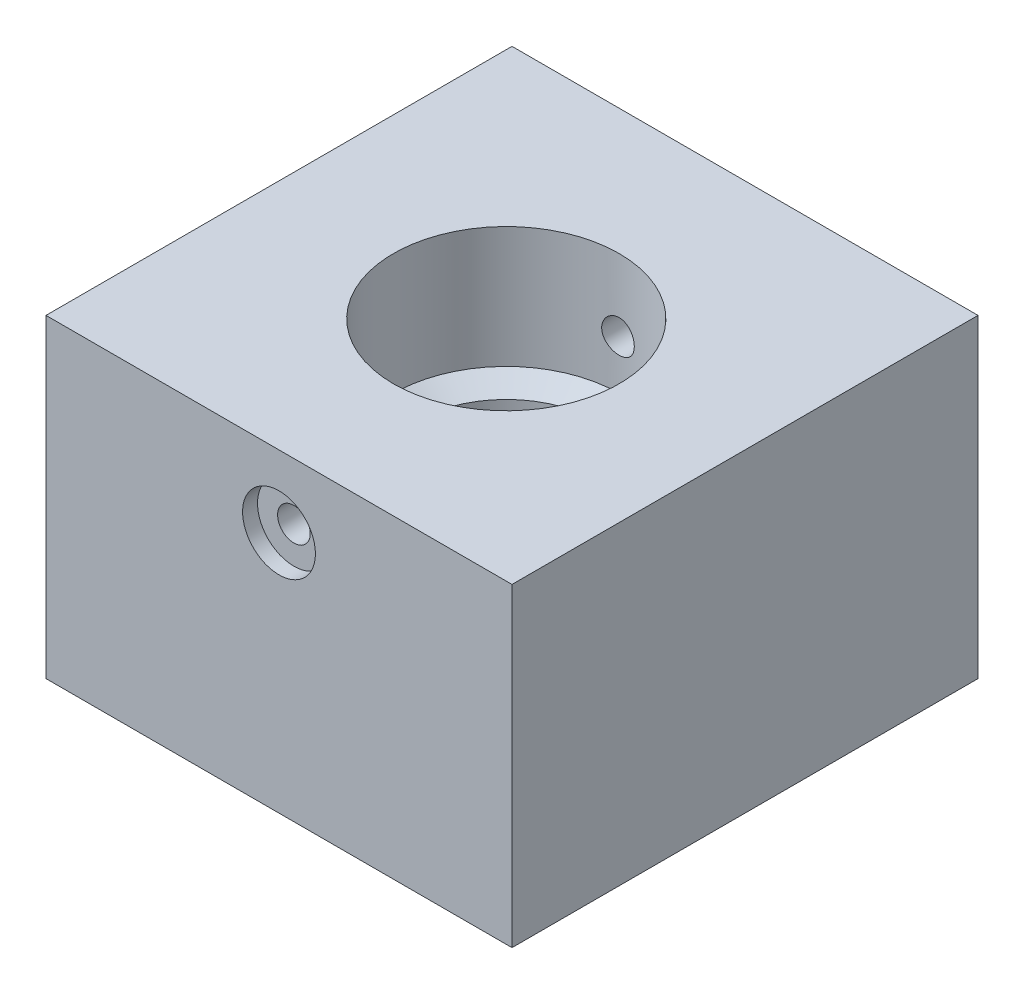
ISO-10303-21;
HEADER;
FILE_DESCRIPTION(('STEP AP214'),'2;1');
FILE_NAME('part.step','',(''),(''),'','','');
FILE_SCHEMA(('AUTOMOTIVE_DESIGN { 1 0 10303 214 1 1 1 1 }'));
ENDSEC;
DATA;
#1=APPLICATION_CONTEXT('core data for automotive mechanical design processes');
#2=APPLICATION_PROTOCOL_DEFINITION('international standard','automotive_design',2000,#1);
#3=PRODUCT_CONTEXT('',#1,'mechanical');
#4=PRODUCT('Part','Part','',(#3));
#5=PRODUCT_RELATED_PRODUCT_CATEGORY('part','',(#4));
#6=PRODUCT_DEFINITION_FORMATION('','',#4);
#7=PRODUCT_DEFINITION_CONTEXT('part definition',#1,'design');
#8=PRODUCT_DEFINITION('design','',#6,#7);
#9=PRODUCT_DEFINITION_SHAPE('','',#8);
#10=(LENGTH_UNIT() NAMED_UNIT(*) SI_UNIT(.MILLI.,.METRE.));
#11=(NAMED_UNIT(*) PLANE_ANGLE_UNIT() SI_UNIT($,.RADIAN.));
#12=(NAMED_UNIT(*) SI_UNIT($,.STERADIAN.) SOLID_ANGLE_UNIT());
#13=UNCERTAINTY_MEASURE_WITH_UNIT(LENGTH_MEASURE(1.E-05),#10,'distance_accuracy_value','');
#14=(GEOMETRIC_REPRESENTATION_CONTEXT(3) GLOBAL_UNCERTAINTY_ASSIGNED_CONTEXT((#13)) GLOBAL_UNIT_ASSIGNED_CONTEXT((#10,
#11,#12)) REPRESENTATION_CONTEXT('',''));
#15=CARTESIAN_POINT('',(0.,0.,0.));
#16=DIRECTION('',(0.,0.,1.));
#17=DIRECTION('',(1.,0.,0.));
#18=AXIS2_PLACEMENT_3D('',#15,#16,#17);
#19=CARTESIAN_POINT('',(12.7,0.,12.3889617824692));
#20=DIRECTION('',(0.,-1.,0.));
#21=DIRECTION('',(0.,0.,-1.));
#22=AXIS2_PLACEMENT_3D('',#19,#20,#21);
#23=PLANE('',#22);
#24=CARTESIAN_POINT('',(0.,0.,0.));
#25=DIRECTION('',(0.,1.,0.));
#26=DIRECTION('',(0.,0.,1.));
#27=AXIS2_PLACEMENT_3D('',#24,#25,#26);
#28=CIRCLE('',#27,6.15188);
#29=CARTESIAN_POINT('',(0.,0.,6.15188));
#30=VERTEX_POINT('',#29);
#31=EDGE_CURVE('E176',#30,#30,#28,.T.);
#32=ORIENTED_EDGE('',*,*,#31,.F.);
#33=EDGE_LOOP('',(#32));
#34=FACE_BOUND('',#33,.T.);
#35=DIRECTION('',(0.,0.,1.));
#36=VECTOR('',#35,1.);
#37=CARTESIAN_POINT('',(-12.7,0.,12.3889617824692));
#38=LINE('',#37,#36);
#39=CARTESIAN_POINT('',(-12.7,0.,-13.0110382175307));
#40=VERTEX_POINT('',#39);
#41=CARTESIAN_POINT('',(-12.7,0.,12.3889617824692));
#42=VERTEX_POINT('',#41);
#43=EDGE_CURVE('E113',#40,#42,#38,.T.);
#44=ORIENTED_EDGE('',*,*,#43,.T.);
#45=DIRECTION('',(-1.,0.,0.));
#46=VECTOR('',#45,1.);
#47=CARTESIAN_POINT('',(12.7,0.,12.3889617824692));
#48=LINE('',#47,#46);
#49=CARTESIAN_POINT('',(12.7,0.,12.3889617824692));
#50=VERTEX_POINT('',#49);
#51=EDGE_CURVE('E11',#50,#42,#48,.T.);
#52=ORIENTED_EDGE('',*,*,#51,.F.);
#53=DIRECTION('',(0.,0.,1.));
#54=VECTOR('',#53,1.);
#55=CARTESIAN_POINT('',(12.7,0.,12.3889617824692));
#56=LINE('',#55,#54);
#57=CARTESIAN_POINT('',(12.7,0.,-13.0110382175307));
#58=VERTEX_POINT('',#57);
#59=EDGE_CURVE('E125',#58,#50,#56,.T.);
#60=ORIENTED_EDGE('',*,*,#59,.F.);
#61=DIRECTION('',(-1.,0.,0.));
#62=VECTOR('',#61,1.);
#63=CARTESIAN_POINT('',(12.7,0.,-13.0110382175307));
#64=LINE('',#63,#62);
#65=EDGE_CURVE('E130',#58,#40,#64,.T.);
#66=ORIENTED_EDGE('',*,*,#65,.T.);
#67=EDGE_LOOP('',(#44,#52,#60,#66));
#68=FACE_BOUND('',#67,.T.);
#69=ADVANCED_FACE('F45',(#34,#68),#23,.F.);
#70=CARTESIAN_POINT('',(12.7,0.,12.3889617824692));
#71=DIRECTION('',(0.,0.,-1.));
#72=DIRECTION('',(-1.,0.,0.));
#73=AXIS2_PLACEMENT_3D('',#70,#71,#72);
#74=PLANE('',#73);
#75=CARTESIAN_POINT('',(0.,-3.91430480134355,12.3889617824692));
#76=DIRECTION('',(0.,0.,1.));
#77=DIRECTION('',(1.,0.,0.));
#78=AXIS2_PLACEMENT_3D('',#75,#76,#77);
#79=CIRCLE('',#78,1.98501);
#80=CARTESIAN_POINT('',(1.98501,-3.91430480134355,12.3889617824692));
#81=VERTEX_POINT('',#80);
#82=EDGE_CURVE('E289',#81,#81,#79,.T.);
#83=ORIENTED_EDGE('',*,*,#82,.F.);
#84=EDGE_LOOP('',(#83));
#85=FACE_BOUND('',#84,.T.);
#86=DIRECTION('',(0.,-1.,0.));
#87=VECTOR('',#86,1.);
#88=CARTESIAN_POINT('',(-12.7,0.,12.3889617824692));
#89=LINE('',#88,#87);
#90=CARTESIAN_POINT('',(-12.7,-17.1469485852361,12.3889617824692));
#91=VERTEX_POINT('',#90);
#92=EDGE_CURVE('E117',#42,#91,#89,.T.);
#93=ORIENTED_EDGE('',*,*,#92,.T.);
#94=DIRECTION('',(-1.,0.,0.));
#95=VECTOR('',#94,1.);
#96=CARTESIAN_POINT('',(12.7,-17.1469485852361,12.3889617824692));
#97=LINE('',#96,#95);
#98=CARTESIAN_POINT('',(12.7,-17.1469485852361,12.3889617824692));
#99=VERTEX_POINT('',#98);
#100=EDGE_CURVE('E59',#99,#91,#97,.T.);
#101=ORIENTED_EDGE('',*,*,#100,.F.);
#102=DIRECTION('',(0.,-1.,0.));
#103=VECTOR('',#102,1.);
#104=CARTESIAN_POINT('',(12.7,0.,12.3889617824692));
#105=LINE('',#104,#103);
#106=EDGE_CURVE('E99',#50,#99,#105,.T.);
#107=ORIENTED_EDGE('',*,*,#106,.F.);
#108=ORIENTED_EDGE('',*,*,#51,.T.);
#109=EDGE_LOOP('',(#93,#101,#107,#108));
#110=FACE_BOUND('',#109,.T.);
#111=ADVANCED_FACE('F165',(#85,#110),#74,.F.);
#112=CARTESIAN_POINT('',(12.7,-17.1469485852361,12.3889617824692));
#113=DIRECTION('',(0.,1.,0.));
#114=DIRECTION('',(0.,0.,1.));
#115=AXIS2_PLACEMENT_3D('',#112,#113,#114);
#116=PLANE('',#115);
#117=DIRECTION('',(0.,0.,-1.));
#118=VECTOR('',#117,1.);
#119=CARTESIAN_POINT('',(-12.7,-17.1469485852361,12.3889617824692));
#120=LINE('',#119,#118);
#121=CARTESIAN_POINT('',(-12.7,-17.1469485852361,-13.0110382175307));
#122=VERTEX_POINT('',#121);
#123=EDGE_CURVE('E86',#91,#122,#120,.T.);
#124=ORIENTED_EDGE('',*,*,#123,.T.);
#125=DIRECTION('',(-1.,0.,0.));
#126=VECTOR('',#125,1.);
#127=CARTESIAN_POINT('',(12.7,-17.1469485852361,-13.0110382175307));
#128=LINE('',#127,#126);
#129=CARTESIAN_POINT('',(12.7,-17.1469485852361,-13.0110382175307));
#130=VERTEX_POINT('',#129);
#131=EDGE_CURVE('E136',#130,#122,#128,.T.);
#132=ORIENTED_EDGE('',*,*,#131,.F.);
#133=DIRECTION('',(0.,0.,-1.));
#134=VECTOR('',#133,1.);
#135=CARTESIAN_POINT('',(12.7,-17.1469485852361,12.3889617824692));
#136=LINE('',#135,#134);
#137=EDGE_CURVE('E128',#99,#130,#136,.T.);
#138=ORIENTED_EDGE('',*,*,#137,.F.);
#139=ORIENTED_EDGE('',*,*,#100,.T.);
#140=EDGE_LOOP('',(#124,#132,#138,#139));
#141=FACE_BOUND('',#140,.T.);
#142=ADVANCED_FACE('F171',(#141),#116,.F.);
#143=CARTESIAN_POINT('',(12.7,-17.1469485852361,-13.0110382175307));
#144=DIRECTION('',(0.,0.,1.));
#145=DIRECTION('',(0.,-1.,0.));
#146=AXIS2_PLACEMENT_3D('',#143,#144,#145);
#147=PLANE('',#146);
#148=CARTESIAN_POINT('',(0.,-3.91430480134355,-13.0110382175307));
#149=DIRECTION('',(0.,0.,1.));
#150=DIRECTION('',(1.,0.,0.));
#151=AXIS2_PLACEMENT_3D('',#148,#149,#150);
#152=CIRCLE('',#151,0.888999999999991);
#153=CARTESIAN_POINT('',(0.888999999999991,-3.91430480134355,-13.0110382175307));
#154=VERTEX_POINT('',#153);
#155=EDGE_CURVE('E143',#154,#154,#152,.T.);
#156=ORIENTED_EDGE('',*,*,#155,.T.);
#157=EDGE_LOOP('',(#156));
#158=FACE_BOUND('',#157,.T.);
#159=DIRECTION('',(0.,1.,0.));
#160=VECTOR('',#159,1.);
#161=CARTESIAN_POINT('',(-12.7,-17.1469485852361,-13.0110382175307));
#162=LINE('',#161,#160);
#163=EDGE_CURVE('E92',#122,#40,#162,.T.);
#164=ORIENTED_EDGE('',*,*,#163,.T.);
#165=ORIENTED_EDGE('',*,*,#65,.F.);
#166=DIRECTION('',(0.,1.,0.));
#167=VECTOR('',#166,1.);
#168=CARTESIAN_POINT('',(12.7,-17.1469485852361,-13.0110382175307));
#169=LINE('',#168,#167);
#170=EDGE_CURVE('E68',#130,#58,#169,.T.);
#171=ORIENTED_EDGE('',*,*,#170,.F.);
#172=ORIENTED_EDGE('',*,*,#131,.T.);
#173=EDGE_LOOP('',(#164,#165,#171,#172));
#174=FACE_BOUND('',#173,.T.);
#175=ADVANCED_FACE('F185',(#158,#174),#147,.F.);
#176=CARTESIAN_POINT('',(12.7,0.,0.));
#177=DIRECTION('',(1.,0.,0.));
#178=DIRECTION('',(0.,0.,-1.));
#179=AXIS2_PLACEMENT_3D('',#176,#177,#178);
#180=PLANE('',#179);
#181=ORIENTED_EDGE('',*,*,#59,.T.);
#182=ORIENTED_EDGE('',*,*,#106,.T.);
#183=ORIENTED_EDGE('',*,*,#137,.T.);
#184=ORIENTED_EDGE('',*,*,#170,.T.);
#185=EDGE_LOOP('',(#181,#182,#183,#184));
#186=FACE_BOUND('',#185,.T.);
#187=ADVANCED_FACE('F183',(#186),#180,.T.);
#188=CARTESIAN_POINT('',(-12.7,0.,0.));
#189=DIRECTION('',(1.,0.,0.));
#190=DIRECTION('',(0.,0.,-1.));
#191=AXIS2_PLACEMENT_3D('',#188,#189,#190);
#192=PLANE('',#191);
#193=ORIENTED_EDGE('',*,*,#43,.F.);
#194=ORIENTED_EDGE('',*,*,#163,.F.);
#195=ORIENTED_EDGE('',*,*,#123,.F.);
#196=ORIENTED_EDGE('',*,*,#92,.F.);
#197=EDGE_LOOP('',(#193,#194,#195,#196));
#198=FACE_BOUND('',#197,.T.);
#199=ADVANCED_FACE('F181',(#198),#192,.F.);
#200=CARTESIAN_POINT('',(0.,-6.604,0.));
#201=DIRECTION('',(0.,1.,0.));
#202=DIRECTION('',(0.,0.,1.));
#203=AXIS2_PLACEMENT_3D('',#200,#201,#202);
#204=CONICAL_SURFACE('',#203,6.15188,1.02974425867665);
#205=CARTESIAN_POINT('',(0.,-6.604,0.));
#206=DIRECTION('',(0.,1.,0.));
#207=DIRECTION('',(0.,0.,1.));
#208=AXIS2_PLACEMENT_3D('',#205,#206,#207);
#209=CIRCLE('',#208,6.15188);
#210=CARTESIAN_POINT('',(0.,-6.604,6.15188));
#211=VERTEX_POINT('',#210);
#212=EDGE_CURVE('E120',#211,#211,#209,.T.);
#213=ORIENTED_EDGE('',*,*,#212,.T.);
#214=EDGE_LOOP('',(#213));
#215=FACE_BOUND('',#214,.T.);
#216=CARTESIAN_POINT('',(0.,-7.31978122102277,0.));
#217=DIRECTION('',(0.,1.,0.));
#218=DIRECTION('',(0.,0.,1.));
#219=AXIS2_PLACEMENT_3D('',#216,#217,#218);
#220=CIRCLE('',#219,4.96062);
#221=CARTESIAN_POINT('',(0.,-7.31978122102277,4.96062));
#222=VERTEX_POINT('',#221);
#223=EDGE_CURVE('E114',#222,#222,#220,.T.);
#224=ORIENTED_EDGE('',*,*,#223,.F.);
#225=EDGE_LOOP('',(#224));
#226=FACE_BOUND('',#225,.T.);
#227=ADVANCED_FACE('F190',(#215,#226),#204,.F.);
#228=CARTESIAN_POINT('',(0.,0.,0.));
#229=DIRECTION('',(0.,1.,0.));
#230=DIRECTION('',(0.,0.,1.));
#231=AXIS2_PLACEMENT_3D('',#228,#229,#230);
#232=CYLINDRICAL_SURFACE('',#231,6.15188);
#233=CARTESIAN_POINT('',(0.,-4.80330480134354,6.15188));
#234=CARTESIAN_POINT('',(0.0496580525019961,-4.80330273774695,6.15187922485455));
#235=CARTESIAN_POINT('',(0.0993454415572061,-4.79913003513258,6.15127242659847));
#236=CARTESIAN_POINT('',(0.197332840335094,-4.78255287015397,6.1489101796665));
#237=CARTESIAN_POINT('',(0.245631426726915,-4.77014025620123,6.1471535935513));
#238=CARTESIAN_POINT('',(0.33940884737092,-4.7374606746797,6.14268928646997));
#239=CARTESIAN_POINT('',(0.384889729896958,-4.71719949205967,6.13998226617816));
#240=CARTESIAN_POINT('',(0.47179865583596,-4.66941171833963,6.13391667208165));
#241=CARTESIAN_POINT('',(0.51322729175207,-4.6418861915858,6.13055819374538));
#242=CARTESIAN_POINT('',(0.591164332339686,-4.58013765043591,6.12353619853031));
#243=CARTESIAN_POINT('',(0.62763900188475,-4.54587226153361,6.11987084064044));
#244=CARTESIAN_POINT('',(0.694341782902631,-4.47170782214583,6.11266270497817));
#245=CARTESIAN_POINT('',(0.724569545173251,-4.43180845693073,6.10911993406759));
#246=CARTESIAN_POINT('',(0.778050522631904,-4.3472836449229,6.10254019505593));
#247=CARTESIAN_POINT('',(0.801271329196397,-4.30263749120304,6.0995056053121));
#248=CARTESIAN_POINT('',(0.839872168315951,-4.21002767984526,6.09431078502836));
#249=CARTESIAN_POINT('',(0.855252597298534,-4.16206419007879,6.09215051028222));
#250=CARTESIAN_POINT('',(0.877631816034659,-4.0645350259596,6.08896691528374));
#251=CARTESIAN_POINT('',(0.884688193173109,-4.01498282519166,6.08793578698642));
#252=CARTESIAN_POINT('',(0.890397356506826,-3.9153877294591,6.08710349159241));
#253=CARTESIAN_POINT('',(0.889050591046564,-3.865344860816,6.0873022588754));
#254=CARTESIAN_POINT('',(0.878038809034291,-3.76659447259578,6.0889001543237));
#255=CARTESIAN_POINT('',(0.868437763923927,-3.71787964865373,6.09029005086256));
#256=CARTESIAN_POINT('',(0.841290024469741,-3.62275978116912,6.09409918418308));
#257=CARTESIAN_POINT('',(0.823743120188379,-3.57635479869084,6.09651844816155));
#258=CARTESIAN_POINT('',(0.781134700489341,-3.48697628326507,6.10212398890146));
#259=CARTESIAN_POINT('',(0.756045924125917,-3.44401592722661,6.1053130397634));
#260=CARTESIAN_POINT('',(0.699085372737413,-3.3628907299194,6.11209679407467));
#261=CARTESIAN_POINT('',(0.667213184101411,-3.32472618129538,6.11569152225344));
#262=CARTESIAN_POINT('',(0.597238598131892,-3.2539050623315,6.12292244663762));
#263=CARTESIAN_POINT('',(0.559081166780746,-3.22130285132055,6.12655871826201));
#264=CARTESIAN_POINT('',(0.477807262928281,-3.16295693766632,6.13343200452748));
#265=CARTESIAN_POINT('',(0.434690771439798,-3.13721326128413,6.13666901763979));
#266=CARTESIAN_POINT('',(0.344676769691215,-3.09331304060042,6.14238210088791));
#267=CARTESIAN_POINT('',(0.297777277501193,-3.07516050453285,6.14485776884018));
#268=CARTESIAN_POINT('',(0.201551871285463,-3.0470041382397,6.14876580354037));
#269=CARTESIAN_POINT('',(0.15222610960804,-3.03699979707034,6.15019823570523));
#270=CARTESIAN_POINT('',(0.0530177005680806,-3.02549566008043,6.15184977743811));
#271=CARTESIAN_POINT('',(0.00314389412874935,-3.02392109661477,6.15207955351692));
#272=CARTESIAN_POINT('',(-0.0961558054482712,-3.02912302308965,6.15132887349875));
#273=CARTESIAN_POINT('',(-0.145581711387129,-3.0358992735976,6.15034845210026));
#274=CARTESIAN_POINT('',(-0.242357491662642,-3.0575483131403,6.14729414087933));
#275=CARTESIAN_POINT('',(-0.28971564176984,-3.07238485767106,6.14522514731358));
#276=CARTESIAN_POINT('',(-0.381272118932988,-3.10969523571111,6.14022500981312));
#277=CARTESIAN_POINT('',(-0.425470306826445,-3.13216940532552,6.13729382793728));
#278=CARTESIAN_POINT('',(-0.509782221231426,-3.1842937688184,6.13086874681967));
#279=CARTESIAN_POINT('',(-0.549866204082315,-3.21399161134098,6.12737116494191));
#280=CARTESIAN_POINT('',(-0.624507839514173,-3.27965372000635,6.1202145459121));
#281=CARTESIAN_POINT('',(-0.65906519496845,-3.31561832285034,6.11655550009279));
#282=CARTESIAN_POINT('',(-0.721943090883072,-3.39312510172226,6.10945473847014));
#283=CARTESIAN_POINT('',(-0.750213638931739,-3.43470803336326,6.10601490981981));
#284=CARTESIAN_POINT('',(-0.799368432874626,-3.52207624120651,6.09977492709275));
#285=CARTESIAN_POINT('',(-0.820252866855024,-3.56786141036207,6.09697475672786));
#286=CARTESIAN_POINT('',(-0.853964300276303,-3.66218248463677,6.09234462560586));
#287=CARTESIAN_POINT('',(-0.866818047075673,-3.71070866508735,6.0905114473539));
#288=CARTESIAN_POINT('',(-0.884188620658714,-3.80925931760307,6.08801415276363));
#289=CARTESIAN_POINT('',(-0.888705978350325,-3.85928369404849,6.0873499619778));
#290=CARTESIAN_POINT('',(-0.889263587849598,-3.95891268377842,6.08726848642285));
#291=CARTESIAN_POINT('',(-0.885382425330023,-4.00851686576257,6.08783964238461));
#292=CARTESIAN_POINT('',(-0.86942110396331,-4.1063593496832,6.09013944758443));
#293=CARTESIAN_POINT('',(-0.857340954596896,-4.15459765319901,6.09186809548404));
#294=CARTESIAN_POINT('',(-0.825351623940064,-4.24831995646824,6.09628417737684));
#295=CARTESIAN_POINT('',(-0.805447539575179,-4.29380572715089,6.09897098706721));
#296=CARTESIAN_POINT('',(-0.758383115800926,-4.38080486922445,6.10500147366075));
#297=CARTESIAN_POINT('',(-0.731222566494435,-4.42231812566108,6.10834516956397));
#298=CARTESIAN_POINT('',(-0.670129204134666,-4.50059372511905,6.11534999107293));
#299=CARTESIAN_POINT('',(-0.63613808525536,-4.53731033600878,6.11901368449572));
#300=CARTESIAN_POINT('',(-0.562471563843658,-4.60454673349383,6.12622396307019));
#301=CARTESIAN_POINT('',(-0.522794838123248,-4.63506507358323,6.12977052072427));
#302=CARTESIAN_POINT('',(-0.438646800423574,-4.68917618414266,6.13636742665655));
#303=CARTESIAN_POINT('',(-0.394152107718565,-4.71273290581917,6.13941515683159));
#304=CARTESIAN_POINT('',(-0.301815670390825,-4.75200409414396,6.14464520643312));
#305=CARTESIAN_POINT('',(-0.253977492866722,-4.76772677743036,6.14682843208926));
#306=CARTESIAN_POINT('',(-0.171597199144601,-4.78727011962952,6.14957850922062));
#307=CARTESIAN_POINT('',(-0.137566369323902,-4.79327406664209,6.15043718990285));
#308=CARTESIAN_POINT('',(-0.0690284153473165,-4.8012921025968,6.1515882015759));
#309=CARTESIAN_POINT('',(-0.0345212964931908,-4.8033062359151,6.1518805388658));
#310=CARTESIAN_POINT('',(0.,-4.80330480134354,6.15188));
#311=B_SPLINE_CURVE_WITH_KNOTS('',3,(#233,#234,#235,#236,#237,#238,#239,#240,#241,#242,#243,
#244,#245,#246,#247,#248,#249,#250,#251,#252,#253,#254,#255,#256,#257,#258,#259,#260,#261,#262,
#263,#264,#265,#266,#267,#268,#269,#270,#271,#272,#273,#274,#275,#276,#277,#278,#279,#280,#281,
#282,#283,#284,#285,#286,#287,#288,#289,#290,#291,#292,#293,#294,#295,#296,#297,#298,#299,#300,
#301,#302,#303,#304,#305,#306,#307,#308,#309,#310),.UNSPECIFIED.,.T.,.F.,(4,2,2,2,2,2,2,2,2,2,2,
2,2,2,2,2,2,2,2,2,2,2,2,2,2,2,2,2,2,2,2,2,2,2,2,2,2,2,4),(0.,0.148848024833848,
0.297843522086386,0.446729407469517,0.595593490714583,0.745425279497036,0.895265441614242,
1.04578838185021,1.19630371054503,1.34577152205573,1.4952313588721,1.64354320366378,
1.79185896723126,1.9407174162999,2.08958494444644,2.23983297226371,2.39008157536716,
2.54040941208284,2.69072782155834,2.83971075062875,2.98868940819505,3.13700363644207,
3.28532439232426,3.43465137383945,3.58398638088708,3.73446950312919,3.88494879306739,
4.0349241802079,4.18489001574629,4.33345868011065,4.48202717268112,4.63049903984509,
4.77897520210212,4.92877714847152,5.07861401442575,5.22921369439159,5.37965508541916,
5.48313244087791,5.5866086454171),.UNSPECIFIED.);
#312=CARTESIAN_POINT('',(0.,-4.80330480134354,6.15188));
#313=VERTEX_POINT('',#312);
#314=EDGE_CURVE('E48',#313,#313,#311,.T.);
#315=ORIENTED_EDGE('',*,*,#314,.T.);
#316=EDGE_LOOP('',(#315));
#317=FACE_BOUND('',#316,.T.);
#318=CARTESIAN_POINT('',(0.888999999999996,-3.91430480134355,-6.08730700181944));
#319=CARTESIAN_POINT('',(0.888997933773882,-3.96395980197514,-6.08730780784258));
#320=CARTESIAN_POINT('',(0.884825726723641,-4.01364414753813,-6.08792113713823));
#321=CARTESIAN_POINT('',(0.868250708816883,-4.11162522393453,-6.09030669650215));
#322=CARTESIAN_POINT('',(0.855839735418416,-4.15992052902016,-6.09208007586236));
#323=CARTESIAN_POINT('',(0.823164951911548,-4.25369100736788,-6.09658077757224));
#324=CARTESIAN_POINT('',(0.80290700438142,-4.29916825668275,-6.0993073876028));
#325=CARTESIAN_POINT('',(0.755126851928977,-4.3860710807637,-6.10540648209951));
#326=CARTESIAN_POINT('',(0.727605703569137,-4.42749724363249,-6.10877887260579));
#327=CARTESIAN_POINT('',(0.665861609795258,-4.50543701829376,-6.1158176029388));
#328=CARTESIAN_POINT('',(0.631595309537621,-4.54191612538698,-6.11948574858748));
#329=CARTESIAN_POINT('',(0.557427176447415,-4.60862748769491,-6.12668653775676));
#330=CARTESIAN_POINT('',(0.517525041075612,-4.63885940733743,-6.13021917399008));
#331=CARTESIAN_POINT('',(0.432997743950854,-4.69234477880037,-6.13676972236972));
#332=CARTESIAN_POINT('',(0.388352351886186,-4.71556657278299,-6.13978527366291));
#333=CARTESIAN_POINT('',(0.295744193951206,-4.75416944673033,-6.14494191314706));
#334=CARTESIAN_POINT('',(0.247781591175202,-4.76955091186264,-6.14708304429415));
#335=CARTESIAN_POINT('',(0.150255379614434,-4.7919322270576,-6.1502368604536));
#336=CARTESIAN_POINT('',(0.10070526785106,-4.7989897783129,-6.15125731056197));
#337=CARTESIAN_POINT('',(0.0011142798908155,-4.80470201394267,-6.15208137929725));
#338=CARTESIAN_POINT('',(-0.04892657075981,-4.80335713342595,-6.15188506093291));
#339=CARTESIAN_POINT('',(-0.147685145432091,-4.79234838273015,-6.15030393493876));
#340=CARTESIAN_POINT('',(-0.196409950809825,-4.78274658468232,-6.14892799545246));
#341=CARTESIAN_POINT('',(-0.291549390549317,-4.75559389776034,-6.14515211731504));
#342=CARTESIAN_POINT('',(-0.337963968938011,-4.73804281639185,-6.14275215386696));
#343=CARTESIAN_POINT('',(-0.427354298440267,-4.69542565264673,-6.13718262314945));
#344=CARTESIAN_POINT('',(-0.47031733571591,-4.67033326806319,-6.1340103698016));
#345=CARTESIAN_POINT('',(-0.551446374791639,-4.61336496420249,-6.1272501305987));
#346=CARTESIAN_POINT('',(-0.589612082995566,-4.58148863006935,-6.12366211932509));
#347=CARTESIAN_POINT('',(-0.660428696067795,-4.51151104381894,-6.11643217533932));
#348=CARTESIAN_POINT('',(-0.693026073156566,-4.47335561871953,-6.11279004940292));
#349=CARTESIAN_POINT('',(-0.751363181100466,-4.39208747213572,-6.10589440604333));
#350=CARTESIAN_POINT('',(-0.777102875272012,-4.34897472413505,-6.10264089069896));
#351=CARTESIAN_POINT('',(-0.821000205947727,-4.25896185914331,-6.09689093159004));
#352=CARTESIAN_POINT('',(-0.839152626678331,-4.21205916314633,-6.09439500894451));
#353=CARTESIAN_POINT('',(-0.867307786229661,-4.11582677507745,-6.09045226138712));
#354=CARTESIAN_POINT('',(-0.877311056189967,-4.06649724140252,-6.08900536810303));
#355=CARTESIAN_POINT('',(-0.888811141300297,-3.96728688570882,-6.08733737157994));
#356=CARTESIAN_POINT('',(-0.890383706285108,-3.91741502132419,-6.0871053531398));
#357=CARTESIAN_POINT('',(-0.885178475947963,-3.81811968125252,-6.08786442424909));
#358=CARTESIAN_POINT('',(-0.878400920496811,-3.76869619272624,-6.08885547866376));
#359=CARTESIAN_POINT('',(-0.856751977707765,-3.67193342338014,-6.09193901819143));
#360=CARTESIAN_POINT('',(-0.841918079953944,-3.62458557813127,-6.0940264001561));
#361=CARTESIAN_POINT('',(-0.804616433799362,-3.53304854434369,-6.09906320976404));
#362=CARTESIAN_POINT('',(-0.782148333471668,-3.4888595015354,-6.10201267714747));
#363=CARTESIAN_POINT('',(-0.730033076518943,-3.40455413068078,-6.10846714627864));
#364=CARTESIAN_POINT('',(-0.700336734217937,-3.36446849960477,-6.11197589473152));
#365=CARTESIAN_POINT('',(-0.634676608222873,-3.2898228431841,-6.11914218638591));
#366=CARTESIAN_POINT('',(-0.598712496364324,-3.25526310734303,-6.12279973737065));
#367=CARTESIAN_POINT('',(-0.521204746734372,-3.19237961970012,-6.12988550098762));
#368=CARTESIAN_POINT('',(-0.479620252356461,-3.16410596980579,-6.13331172934796));
#369=CARTESIAN_POINT('',(-0.392248048942665,-3.11494573941599,-6.13951825414501));
#370=CARTESIAN_POINT('',(-0.346460448108135,-3.09405896882584,-6.14229856720313));
#371=CARTESIAN_POINT('',(-0.252140547414333,-3.06034608260528,-6.14689127696253));
#372=CARTESIAN_POINT('',(-0.203618338213721,-3.04749220863768,-6.14870700357299));
#373=CARTESIAN_POINT('',(-0.105076097413936,-3.0301200366974,-6.15117990173415));
#374=CARTESIAN_POINT('',(-0.0550561575178491,-3.02560122944134,-6.15183714406962));
#375=CARTESIAN_POINT('',(0.0445749766297683,-3.02503920905878,-6.15191839974214));
#376=CARTESIAN_POINT('',(0.0941857457588038,-3.02891919947083,-6.1513535872582));
#377=CARTESIAN_POINT('',(0.192041706607304,-3.04488048601369,-6.14907664843728));
#378=CARTESIAN_POINT('',(0.240286901802641,-3.05696176126736,-6.1473645250209));
#379=CARTESIAN_POINT('',(0.334023680709111,-3.08895614193527,-6.14298443222245));
#380=CARTESIAN_POINT('',(0.379516980035383,-3.10886430853518,-6.14031706569877));
#381=CARTESIAN_POINT('',(0.466529488987314,-3.15593924087386,-6.13432001695878));
#382=CARTESIAN_POINT('',(0.508048588339058,-3.18310620794656,-6.13099031637228));
#383=CARTESIAN_POINT('',(0.586324370792666,-3.24420684798187,-6.12400287514006));
#384=CARTESIAN_POINT('',(0.62303646915549,-3.27819734550275,-6.12034253212091));
#385=CARTESIAN_POINT('',(0.690264051093692,-3.35186073825492,-6.11312598186633));
#386=CARTESIAN_POINT('',(0.720778076069817,-3.39153496730754,-6.10956979931121));
#387=CARTESIAN_POINT('',(0.774884282018878,-3.47568075916744,-6.10294445012642));
#388=CARTESIAN_POINT('',(0.798439704725621,-3.52017615871799,-6.09987790776528));
#389=CARTESIAN_POINT('',(0.837708271665469,-3.61251404657523,-6.09460977928715));
#390=CARTESIAN_POINT('',(0.853429646753638,-3.66035296147813,-6.09240728587565));
#391=CARTESIAN_POINT('',(0.872969491085571,-3.74272979760191,-6.08963163414601));
#392=CARTESIAN_POINT('',(0.878971866438388,-3.77675618922452,-6.08876445202888));
#393=CARTESIAN_POINT('',(0.886987815984208,-3.84528526475937,-6.08760185902466));
#394=CARTESIAN_POINT('',(0.889001436303144,-3.87978794315919,-6.0873064415257));
#395=CARTESIAN_POINT('',(0.888999999999996,-3.91430480134355,-6.08730700181944));
#396=B_SPLINE_CURVE_WITH_KNOTS('',3,(#318,#319,#320,#321,#322,#323,#324,#325,#326,#327,#328,
#329,#330,#331,#332,#333,#334,#335,#336,#337,#338,#339,#340,#341,#342,#343,#344,#345,#346,#347,
#348,#349,#350,#351,#352,#353,#354,#355,#356,#357,#358,#359,#360,#361,#362,#363,#364,#365,#366,
#367,#368,#369,#370,#371,#372,#373,#374,#375,#376,#377,#378,#379,#380,#381,#382,#383,#384,#385,
#386,#387,#388,#389,#390,#391,#392,#393,#394,#395),.UNSPECIFIED.,.T.,.F.,(4,2,2,2,2,2,2,2,2,2,2,
2,2,2,2,2,2,2,2,2,2,2,2,2,2,2,2,2,2,2,2,2,2,2,2,2,2,2,4),(0.,0.148838855436466,
0.297825393206222,0.446700835186332,0.595554632496137,0.745398423788297,0.895250261956732,
1.04576904394623,1.19628043076809,1.34574222650717,1.49519628262915,1.64353652941456,
1.79188036849654,1.94074771994557,2.08962417763349,2.23985978750219,2.39009620100524,
2.54043572341153,2.69076544631073,2.83974216547978,2.98871460514981,3.1369996794738,
3.28529159047689,3.43462226248492,3.58396075541777,3.73444994428144,3.88493526015967,
4.0348976437093,4.18485086405926,4.33343874621213,4.48202625012195,4.63052014454324,
4.77901815809775,4.9288083517452,5.07863375494349,5.22923699967749,5.37968167747169,
5.48314575985094,5.58660864576527),.UNSPECIFIED.);
#397=CARTESIAN_POINT('',(0.888999999999996,-3.91430480134355,-6.08730700181944));
#398=VERTEX_POINT('',#397);
#399=EDGE_CURVE('E138',#398,#398,#396,.T.);
#400=ORIENTED_EDGE('',*,*,#399,.T.);
#401=EDGE_LOOP('',(#400));
#402=FACE_BOUND('',#401,.T.);
#403=ORIENTED_EDGE('',*,*,#212,.F.);
#404=EDGE_LOOP('',(#403));
#405=FACE_BOUND('',#404,.T.);
#406=ORIENTED_EDGE('',*,*,#31,.T.);
#407=EDGE_LOOP('',(#406));
#408=FACE_BOUND('',#407,.T.);
#409=ADVANCED_FACE('F107',(#317,#402,#405,#408),#232,.F.);
#410=CARTESIAN_POINT('',(0.,-12.2359073812756,0.));
#411=DIRECTION('',(0.,1.,0.));
#412=DIRECTION('',(0.,0.,1.));
#413=AXIS2_PLACEMENT_3D('',#410,#411,#412);
#414=CONICAL_SURFACE('',#413,4.96062,1.02974425867665);
#415=CARTESIAN_POINT('',(0.,-15.2165485852361,0.));
#416=VERTEX_POINT('',#415);
#417=VERTEX_LOOP('',#416);
#418=FACE_BOUND('',#417,.T.);
#419=CARTESIAN_POINT('',(0.,-12.2359073812756,0.));
#420=DIRECTION('',(0.,1.,0.));
#421=DIRECTION('',(0.,0.,1.));
#422=AXIS2_PLACEMENT_3D('',#419,#420,#421);
#423=CIRCLE('',#422,4.96062);
#424=CARTESIAN_POINT('',(0.,-12.2359073812756,4.96062));
#425=VERTEX_POINT('',#424);
#426=EDGE_CURVE('E111',#425,#425,#423,.T.);
#427=ORIENTED_EDGE('',*,*,#426,.T.);
#428=EDGE_LOOP('',(#427));
#429=FACE_BOUND('',#428,.T.);
#430=ADVANCED_FACE('F103',(#418,#429),#414,.F.);
#431=CARTESIAN_POINT('',(0.,0.,0.));
#432=DIRECTION('',(0.,1.,0.));
#433=DIRECTION('',(0.,0.,1.));
#434=AXIS2_PLACEMENT_3D('',#431,#432,#433);
#435=CYLINDRICAL_SURFACE('',#434,4.96062);
#436=ORIENTED_EDGE('',*,*,#223,.T.);
#437=EDGE_LOOP('',(#436));
#438=FACE_BOUND('',#437,.T.);
#439=ORIENTED_EDGE('',*,*,#426,.F.);
#440=EDGE_LOOP('',(#439));
#441=FACE_BOUND('',#440,.T.);
#442=ADVANCED_FACE('F106',(#438,#441),#435,.F.);
#443=CARTESIAN_POINT('',(0.,-3.91430480134355,12.3889617824692));
#444=DIRECTION('',(0.,0.,1.));
#445=DIRECTION('',(1.,0.,0.));
#446=AXIS2_PLACEMENT_3D('',#443,#444,#445);
#447=CYLINDRICAL_SURFACE('',#446,0.888999999999996);
#448=ORIENTED_EDGE('',*,*,#155,.F.);
#449=EDGE_LOOP('',(#448));
#450=FACE_BOUND('',#449,.T.);
#451=ORIENTED_EDGE('',*,*,#399,.F.);
#452=EDGE_LOOP('',(#451));
#453=FACE_BOUND('',#452,.T.);
#454=ADVANCED_FACE('F151',(#450,#453),#447,.F.);
#455=CARTESIAN_POINT('',(0.,-3.91430480134355,11.5761617824692));
#456=DIRECTION('',(0.,0.,1.));
#457=DIRECTION('',(1.,0.,0.));
#458=AXIS2_PLACEMENT_3D('',#455,#456,#457);
#459=CIRCLE('',#458,0.889);
#460=CARTESIAN_POINT('',(0.889,-3.91430480134355,11.5761617824692));
#461=VERTEX_POINT('',#460);
#462=EDGE_CURVE('E283',#461,#461,#459,.T.);
#463=ORIENTED_EDGE('',*,*,#462,.T.);
#464=EDGE_LOOP('',(#463));
#465=FACE_BOUND('',#464,.T.);
#466=ORIENTED_EDGE('',*,*,#314,.F.);
#467=EDGE_LOOP('',(#466));
#468=FACE_BOUND('',#467,.T.);
#469=ADVANCED_FACE('F146',(#465,#468),#447,.F.);
#470=CARTESIAN_POINT('',(0.889,-3.91430480134355,11.5761617824692));
#471=DIRECTION('',(0.,0.,-1.));
#472=DIRECTION('',(-1.,0.,0.));
#473=AXIS2_PLACEMENT_3D('',#470,#471,#472);
#474=PLANE('',#473);
#475=ORIENTED_EDGE('',*,*,#462,.F.);
#476=EDGE_LOOP('',(#475));
#477=FACE_BOUND('',#476,.T.);
#478=CARTESIAN_POINT('',(0.,-3.91430480134355,11.5761617824692));
#479=DIRECTION('',(0.,0.,1.));
#480=DIRECTION('',(1.,0.,0.));
#481=AXIS2_PLACEMENT_3D('',#478,#479,#480);
#482=CIRCLE('',#481,1.98501);
#483=CARTESIAN_POINT('',(1.98501,-3.91430480134355,11.5761617824692));
#484=VERTEX_POINT('',#483);
#485=EDGE_CURVE('E286',#484,#484,#482,.T.);
#486=ORIENTED_EDGE('',*,*,#485,.T.);
#487=EDGE_LOOP('',(#486));
#488=FACE_BOUND('',#487,.T.);
#489=ADVANCED_FACE('F150',(#477,#488),#474,.F.);
#490=CARTESIAN_POINT('',(0.,-3.91430480134355,12.3889617824692));
#491=DIRECTION('',(0.,0.,1.));
#492=DIRECTION('',(1.,0.,0.));
#493=AXIS2_PLACEMENT_3D('',#490,#491,#492);
#494=CYLINDRICAL_SURFACE('',#493,1.98501);
#495=ORIENTED_EDGE('',*,*,#485,.F.);
#496=EDGE_LOOP('',(#495));
#497=FACE_BOUND('',#496,.T.);
#498=ORIENTED_EDGE('',*,*,#82,.T.);
#499=EDGE_LOOP('',(#498));
#500=FACE_BOUND('',#499,.T.);
#501=ADVANCED_FACE('F156',(#497,#500),#494,.F.);
#502=CLOSED_SHELL('',(#69,#111,#142,#175,#187,#199,#227,#409,#430,#442,#454,#469,#489,#501));
#503=MANIFOLD_SOLID_BREP('B2',#502);
#504=ADVANCED_BREP_SHAPE_REPRESENTATION('',(#18,#503),#14);
#505=SHAPE_DEFINITION_REPRESENTATION(#9,#504);
ENDSEC;
END-ISO-10303-21;
